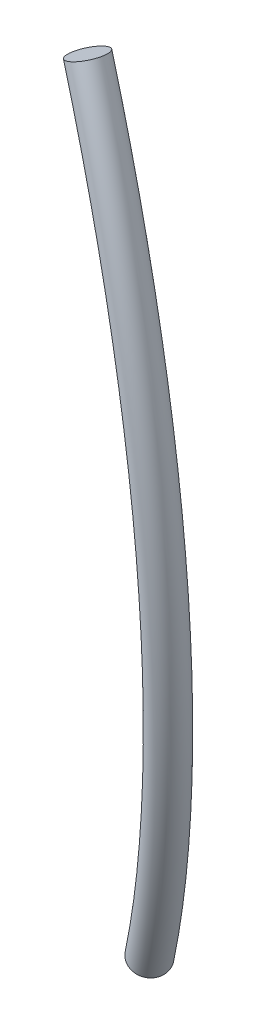
ISO-10303-21;
HEADER;
FILE_DESCRIPTION(('STEP AP214'),'2;1');
FILE_NAME('part.step','',(''),(''),'','','');
FILE_SCHEMA(('AUTOMOTIVE_DESIGN { 1 0 10303 214 1 1 1 1 }'));
ENDSEC;
DATA;
#1=APPLICATION_CONTEXT('core data for automotive mechanical design processes');
#2=APPLICATION_PROTOCOL_DEFINITION('international standard','automotive_design',2000,#1);
#3=PRODUCT_CONTEXT('',#1,'mechanical');
#4=PRODUCT('Part','Part','',(#3));
#5=PRODUCT_RELATED_PRODUCT_CATEGORY('part','',(#4));
#6=PRODUCT_DEFINITION_FORMATION('','',#4);
#7=PRODUCT_DEFINITION_CONTEXT('part definition',#1,'design');
#8=PRODUCT_DEFINITION('design','',#6,#7);
#9=PRODUCT_DEFINITION_SHAPE('','',#8);
#10=(LENGTH_UNIT() NAMED_UNIT(*) SI_UNIT(.MILLI.,.METRE.));
#11=(NAMED_UNIT(*) PLANE_ANGLE_UNIT() SI_UNIT($,.RADIAN.));
#12=(NAMED_UNIT(*) SI_UNIT($,.STERADIAN.) SOLID_ANGLE_UNIT());
#13=UNCERTAINTY_MEASURE_WITH_UNIT(LENGTH_MEASURE(1.E-05),#10,'distance_accuracy_value','');
#14=(GEOMETRIC_REPRESENTATION_CONTEXT(3) GLOBAL_UNCERTAINTY_ASSIGNED_CONTEXT((#13)) GLOBAL_UNIT_ASSIGNED_CONTEXT((#10,
#11,#12)) REPRESENTATION_CONTEXT('',''));
#15=CARTESIAN_POINT('',(0.,0.,0.));
#16=DIRECTION('',(0.,0.,1.));
#17=DIRECTION('',(1.,0.,0.));
#18=AXIS2_PLACEMENT_3D('',#15,#16,#17);
#19=CARTESIAN_POINT('',(4696.39009279413,-1129.89333324173,-17366.119791682));
#20=DIRECTION('',(0.413107215385933,0.0685508645847615,-0.908098677215622));
#21=DIRECTION('',(-0.910239904957732,0.,-0.414081290838573));
#22=AXIS2_PLACEMENT_3D('',#19,#20,#21);
#23=TOROIDAL_SURFACE('',#22,2866.91188227004,50.7999999999773);
#24=CARTESIAN_POINT('',(7072.98958400039,-27.5267562632751,-16201.7545014659));
#25=DIRECTION('',(-0.377017474580283,0.920570518156006,-0.102018356010516));
#26=DIRECTION('',(-0.921610104720906,-0.3838233375866,-0.0575713505157118));
#27=AXIS2_PLACEMENT_3D('',#24,#25,#26);
#28=CIRCLE('',#27,50.7999999999773);
#29=CARTESIAN_POINT('',(7115.10153550468,-7.99346594598127,-16181.1226302498));
#30=VERTEX_POINT('',#29);
#31=EDGE_CURVE('E10',#30,#30,#28,.T.);
#32=CARTESIAN_POINT('',(7076.37596854862,-2386.49192943736,-16378.2883587192));
#33=DIRECTION('',(0.374409423198847,0.896205542275711,0.237977330462811));
#34=DIRECTION('',(-0.922714474924113,0.385484108317734,0.));
#35=AXIS2_PLACEMENT_3D('',#32,#33,#34);
#36=CIRCLE('',#35,50.7999999999773);
#37=CARTESIAN_POINT('',(7118.5479248044,-2408.75812083357,-16360.7845640944));
#38=VERTEX_POINT('',#37);
#39=EDGE_CURVE('E39',#38,#38,#36,.T.);
#40=CARTESIAN_POINT('',(4696.39009279413,-1129.89333324173,-17366.119791682));
#41=DIRECTION('',(0.413107215385933,0.0685508645847615,-0.908098677215622));
#42=DIRECTION('',(-0.910239904957732,0.,-0.414081290838573));
#43=AXIS2_PLACEMENT_3D('',#40,#41,#42);
#44=CIRCLE('',#43,2917.71188227002);
#45=EDGE_CURVE('',#30,#38,#44,.T.);
#46=ORIENTED_EDGE('',*,*,#31,.F.);
#47=ORIENTED_EDGE('',*,*,#39,.T.);
#48=ORIENTED_EDGE('',*,*,#45,.T.);
#49=ORIENTED_EDGE('',*,*,#45,.F.);
#50=EDGE_LOOP('',(#46,#48,#47,#49));
#51=FACE_BOUND('',#50,.T.);
#52=ADVANCED_FACE('F33',(#51),#23,.T.);
#53=CARTESIAN_POINT('',(7072.98958400039,-27.5267562632751,-16201.7545014659));
#54=DIRECTION('',(-0.377017474580283,0.920570518156006,-0.102018356010516));
#55=DIRECTION('',(-0.921610104720906,-0.3838233375866,-0.0575713505157118));
#56=AXIS2_PLACEMENT_3D('',#53,#54,#55);
#57=PLANE('',#56);
#58=ORIENTED_EDGE('',*,*,#31,.T.);
#59=EDGE_LOOP('',(#58));
#60=FACE_BOUND('',#59,.T.);
#61=ADVANCED_FACE('F48',(#60),#57,.T.);
#62=CARTESIAN_POINT('',(7076.37596854862,-2386.49192943736,-16378.2883587192));
#63=DIRECTION('',(0.374409423198847,0.896205542275711,0.237977330462811));
#64=DIRECTION('',(-0.922714474924113,0.385484108317734,0.));
#65=AXIS2_PLACEMENT_3D('',#62,#63,#64);
#66=PLANE('',#65);
#67=ORIENTED_EDGE('',*,*,#39,.F.);
#68=EDGE_LOOP('',(#67));
#69=FACE_BOUND('',#68,.T.);
#70=ADVANCED_FACE('F46',(#69),#66,.F.);
#71=CLOSED_SHELL('',(#52,#61,#70));
#72=MANIFOLD_SOLID_BREP('B2',#71);
#73=ADVANCED_BREP_SHAPE_REPRESENTATION('',(#18,#72),#14);
#74=SHAPE_DEFINITION_REPRESENTATION(#9,#73);
ENDSEC;
END-ISO-10303-21;
